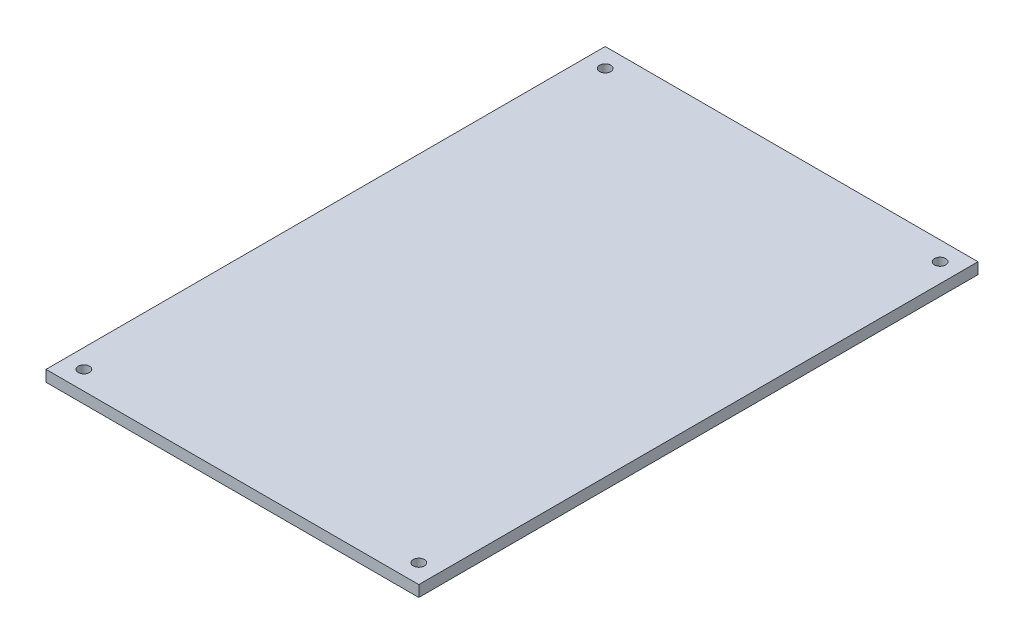
ISO-10303-21;
HEADER;
FILE_DESCRIPTION(('STEP AP214'),'2;1');
FILE_NAME('part.step','',(''),(''),'','','');
FILE_SCHEMA(('AUTOMOTIVE_DESIGN { 1 0 10303 214 1 1 1 1 }'));
ENDSEC;
DATA;
#1=APPLICATION_CONTEXT('core data for automotive mechanical design processes');
#2=APPLICATION_PROTOCOL_DEFINITION('international standard','automotive_design',2000,#1);
#3=PRODUCT_CONTEXT('',#1,'mechanical');
#4=PRODUCT('Part','Part','',(#3));
#5=PRODUCT_RELATED_PRODUCT_CATEGORY('part','',(#4));
#6=PRODUCT_DEFINITION_FORMATION('','',#4);
#7=PRODUCT_DEFINITION_CONTEXT('part definition',#1,'design');
#8=PRODUCT_DEFINITION('design','',#6,#7);
#9=PRODUCT_DEFINITION_SHAPE('','',#8);
#10=(LENGTH_UNIT() NAMED_UNIT(*) SI_UNIT(.MILLI.,.METRE.));
#11=(NAMED_UNIT(*) PLANE_ANGLE_UNIT() SI_UNIT($,.RADIAN.));
#12=(NAMED_UNIT(*) SI_UNIT($,.STERADIAN.) SOLID_ANGLE_UNIT());
#13=UNCERTAINTY_MEASURE_WITH_UNIT(LENGTH_MEASURE(1.E-05),#10,'distance_accuracy_value','');
#14=(GEOMETRIC_REPRESENTATION_CONTEXT(3) GLOBAL_UNCERTAINTY_ASSIGNED_CONTEXT((#13)) GLOBAL_UNIT_ASSIGNED_CONTEXT((#10,
#11,#12)) REPRESENTATION_CONTEXT('',''));
#15=CARTESIAN_POINT('',(0.,0.,0.));
#16=DIRECTION('',(0.,0.,1.));
#17=DIRECTION('',(1.,0.,0.));
#18=AXIS2_PLACEMENT_3D('',#15,#16,#17);
#19=CARTESIAN_POINT('',(49.999999949,3.,74.999999987));
#20=DIRECTION('',(-1.,0.,0.));
#21=DIRECTION('',(0.,0.,1.));
#22=AXIS2_PLACEMENT_3D('',#19,#20,#21);
#23=PLANE('',#22);
#24=DIRECTION('',(0.,0.,-1.));
#25=VECTOR('',#24,1.);
#26=CARTESIAN_POINT('',(49.999999949,0.,74.999999987));
#27=LINE('',#26,#25);
#28=CARTESIAN_POINT('',(49.999999949,0.,74.999999987));
#29=VERTEX_POINT('',#28);
#30=CARTESIAN_POINT('',(49.999999949,0.,-74.999999987));
#31=VERTEX_POINT('',#30);
#32=EDGE_CURVE('E96',#29,#31,#27,.T.);
#33=ORIENTED_EDGE('',*,*,#32,.T.);
#34=DIRECTION('',(0.,-1.,0.));
#35=VECTOR('',#34,1.);
#36=CARTESIAN_POINT('',(49.999999949,3.,-74.999999987));
#37=LINE('',#36,#35);
#38=CARTESIAN_POINT('',(49.999999949,3.,-74.999999987));
#39=VERTEX_POINT('',#38);
#40=EDGE_CURVE('E11',#39,#31,#37,.T.);
#41=ORIENTED_EDGE('',*,*,#40,.F.);
#42=DIRECTION('',(0.,0.,-1.));
#43=VECTOR('',#42,1.);
#44=CARTESIAN_POINT('',(49.999999949,3.,74.999999987));
#45=LINE('',#44,#43);
#46=CARTESIAN_POINT('',(49.999999949,3.,74.999999987));
#47=VERTEX_POINT('',#46);
#48=EDGE_CURVE('E84',#47,#39,#45,.T.);
#49=ORIENTED_EDGE('',*,*,#48,.F.);
#50=DIRECTION('',(0.,-1.,0.));
#51=VECTOR('',#50,1.);
#52=CARTESIAN_POINT('',(49.999999949,3.,74.999999987));
#53=LINE('',#52,#51);
#54=EDGE_CURVE('E92',#47,#29,#53,.T.);
#55=ORIENTED_EDGE('',*,*,#54,.T.);
#56=EDGE_LOOP('',(#33,#41,#49,#55));
#57=FACE_BOUND('',#56,.T.);
#58=ADVANCED_FACE('F33',(#57),#23,.F.);
#59=CARTESIAN_POINT('',(-49.999999949,3.,-74.999999987));
#60=DIRECTION('',(0.,0.,1.));
#61=DIRECTION('',(1.,0.,0.));
#62=AXIS2_PLACEMENT_3D('',#59,#60,#61);
#63=PLANE('',#62);
#64=DIRECTION('',(-1.,0.,0.));
#65=VECTOR('',#64,1.);
#66=CARTESIAN_POINT('',(-49.999999949,0.,-74.999999987));
#67=LINE('',#66,#65);
#68=CARTESIAN_POINT('',(-49.999999949,0.,-74.999999987));
#69=VERTEX_POINT('',#68);
#70=EDGE_CURVE('E88',#31,#69,#67,.T.);
#71=ORIENTED_EDGE('',*,*,#70,.T.);
#72=DIRECTION('',(0.,-1.,0.));
#73=VECTOR('',#72,1.);
#74=CARTESIAN_POINT('',(-49.999999949,3.,-74.999999987));
#75=LINE('',#74,#73);
#76=CARTESIAN_POINT('',(-49.999999949,3.,-74.999999987));
#77=VERTEX_POINT('',#76);
#78=EDGE_CURVE('E41',#77,#69,#75,.T.);
#79=ORIENTED_EDGE('',*,*,#78,.F.);
#80=DIRECTION('',(-1.,0.,0.));
#81=VECTOR('',#80,1.);
#82=CARTESIAN_POINT('',(-49.999999949,3.,-74.999999987));
#83=LINE('',#82,#81);
#84=EDGE_CURVE('E79',#39,#77,#83,.T.);
#85=ORIENTED_EDGE('',*,*,#84,.F.);
#86=ORIENTED_EDGE('',*,*,#40,.T.);
#87=EDGE_LOOP('',(#71,#79,#85,#86));
#88=FACE_BOUND('',#87,.T.);
#89=ADVANCED_FACE('F87',(#88),#63,.F.);
#90=CARTESIAN_POINT('',(-49.999999949,3.,74.999999987));
#91=DIRECTION('',(1.,0.,0.));
#92=DIRECTION('',(0.,0.,-1.));
#93=AXIS2_PLACEMENT_3D('',#90,#91,#92);
#94=PLANE('',#93);
#95=DIRECTION('',(0.,0.,1.));
#96=VECTOR('',#95,1.);
#97=CARTESIAN_POINT('',(-49.999999949,0.,74.999999987));
#98=LINE('',#97,#96);
#99=CARTESIAN_POINT('',(-49.999999949,0.,74.999999987));
#100=VERTEX_POINT('',#99);
#101=EDGE_CURVE('E66',#69,#100,#98,.T.);
#102=ORIENTED_EDGE('',*,*,#101,.T.);
#103=DIRECTION('',(0.,-1.,0.));
#104=VECTOR('',#103,1.);
#105=CARTESIAN_POINT('',(-49.999999949,3.,74.999999987));
#106=LINE('',#105,#104);
#107=CARTESIAN_POINT('',(-49.999999949,3.,74.999999987));
#108=VERTEX_POINT('',#107);
#109=EDGE_CURVE('E89',#108,#100,#106,.T.);
#110=ORIENTED_EDGE('',*,*,#109,.F.);
#111=DIRECTION('',(0.,0.,1.));
#112=VECTOR('',#111,1.);
#113=CARTESIAN_POINT('',(-49.999999949,3.,74.999999987));
#114=LINE('',#113,#112);
#115=EDGE_CURVE('E82',#77,#108,#114,.T.);
#116=ORIENTED_EDGE('',*,*,#115,.F.);
#117=ORIENTED_EDGE('',*,*,#78,.T.);
#118=EDGE_LOOP('',(#102,#110,#116,#117));
#119=FACE_BOUND('',#118,.T.);
#120=ADVANCED_FACE('F90',(#119),#94,.F.);
#121=CARTESIAN_POINT('',(-49.999999949,3.,74.999999987));
#122=DIRECTION('',(0.,0.,-1.));
#123=DIRECTION('',(-1.,0.,0.));
#124=AXIS2_PLACEMENT_3D('',#121,#122,#123);
#125=PLANE('',#124);
#126=DIRECTION('',(1.,0.,0.));
#127=VECTOR('',#126,1.);
#128=CARTESIAN_POINT('',(-49.999999949,0.,74.999999987));
#129=LINE('',#128,#127);
#130=EDGE_CURVE('E72',#100,#29,#129,.T.);
#131=ORIENTED_EDGE('',*,*,#130,.T.);
#132=ORIENTED_EDGE('',*,*,#54,.F.);
#133=DIRECTION('',(1.,0.,0.));
#134=VECTOR('',#133,1.);
#135=CARTESIAN_POINT('',(-49.999999949,3.,74.999999987));
#136=LINE('',#135,#134);
#137=EDGE_CURVE('E49',#108,#47,#136,.T.);
#138=ORIENTED_EDGE('',*,*,#137,.F.);
#139=ORIENTED_EDGE('',*,*,#109,.T.);
#140=EDGE_LOOP('',(#131,#132,#138,#139));
#141=FACE_BOUND('',#140,.T.);
#142=ADVANCED_FACE('F104',(#141),#125,.F.);
#143=CARTESIAN_POINT('',(0.,3.,0.));
#144=DIRECTION('',(0.,-1.,0.));
#145=DIRECTION('',(0.,0.,-1.));
#146=AXIS2_PLACEMENT_3D('',#143,#144,#145);
#147=PLANE('',#146);
#148=CARTESIAN_POINT('',(44.919999949,3.,69.919999987));
#149=DIRECTION('',(0.,1.,0.));
#150=DIRECTION('',(0.,0.,1.));
#151=AXIS2_PLACEMENT_3D('',#148,#149,#150);
#152=CIRCLE('',#151,1.5);
#153=CARTESIAN_POINT('',(44.919999949,3.,71.419999987));
#154=VERTEX_POINT('',#153);
#155=EDGE_CURVE('E128',#154,#154,#152,.T.);
#156=ORIENTED_EDGE('',*,*,#155,.F.);
#157=EDGE_LOOP('',(#156));
#158=FACE_BOUND('',#157,.T.);
#159=CARTESIAN_POINT('',(-44.919999949,3.,69.919999987));
#160=DIRECTION('',(0.,1.,0.));
#161=DIRECTION('',(0.,0.,1.));
#162=AXIS2_PLACEMENT_3D('',#159,#160,#161);
#163=CIRCLE('',#162,1.5);
#164=CARTESIAN_POINT('',(-44.919999949,3.,71.419999987));
#165=VERTEX_POINT('',#164);
#166=EDGE_CURVE('E122',#165,#165,#163,.T.);
#167=ORIENTED_EDGE('',*,*,#166,.F.);
#168=EDGE_LOOP('',(#167));
#169=FACE_BOUND('',#168,.T.);
#170=CARTESIAN_POINT('',(44.919999949,3.,-69.919999987));
#171=DIRECTION('',(0.,1.,0.));
#172=DIRECTION('',(0.,0.,1.));
#173=AXIS2_PLACEMENT_3D('',#170,#171,#172);
#174=CIRCLE('',#173,1.5);
#175=CARTESIAN_POINT('',(44.919999949,3.,-68.419999987));
#176=VERTEX_POINT('',#175);
#177=EDGE_CURVE('E116',#176,#176,#174,.T.);
#178=ORIENTED_EDGE('',*,*,#177,.F.);
#179=EDGE_LOOP('',(#178));
#180=FACE_BOUND('',#179,.T.);
#181=CARTESIAN_POINT('',(-44.919999949,3.,-69.919999987));
#182=DIRECTION('',(0.,1.,0.));
#183=DIRECTION('',(0.,0.,1.));
#184=AXIS2_PLACEMENT_3D('',#181,#182,#183);
#185=CIRCLE('',#184,1.500000048);
#186=CARTESIAN_POINT('',(-44.919999949,3.,-68.419999939));
#187=VERTEX_POINT('',#186);
#188=EDGE_CURVE('E110',#187,#187,#185,.T.);
#189=ORIENTED_EDGE('',*,*,#188,.F.);
#190=EDGE_LOOP('',(#189));
#191=FACE_BOUND('',#190,.T.);
#192=ORIENTED_EDGE('',*,*,#48,.T.);
#193=ORIENTED_EDGE('',*,*,#84,.T.);
#194=ORIENTED_EDGE('',*,*,#115,.T.);
#195=ORIENTED_EDGE('',*,*,#137,.T.);
#196=EDGE_LOOP('',(#192,#193,#194,#195));
#197=FACE_BOUND('',#196,.T.);
#198=ADVANCED_FACE('F80',(#158,#169,#180,#191,#197),#147,.F.);
#199=CARTESIAN_POINT('',(0.,0.,0.));
#200=DIRECTION('',(0.,-1.,0.));
#201=DIRECTION('',(0.,0.,-1.));
#202=AXIS2_PLACEMENT_3D('',#199,#200,#201);
#203=PLANE('',#202);
#204=CARTESIAN_POINT('',(44.919999949,0.,69.919999987));
#205=DIRECTION('',(0.,1.,0.));
#206=DIRECTION('',(0.,0.,1.));
#207=AXIS2_PLACEMENT_3D('',#204,#205,#206);
#208=CIRCLE('',#207,1.5);
#209=CARTESIAN_POINT('',(44.919999949,0.,71.419999987));
#210=VERTEX_POINT('',#209);
#211=EDGE_CURVE('E125',#210,#210,#208,.T.);
#212=ORIENTED_EDGE('',*,*,#211,.T.);
#213=EDGE_LOOP('',(#212));
#214=FACE_BOUND('',#213,.T.);
#215=CARTESIAN_POINT('',(-44.919999949,0.,69.919999987));
#216=DIRECTION('',(0.,1.,0.));
#217=DIRECTION('',(0.,0.,1.));
#218=AXIS2_PLACEMENT_3D('',#215,#216,#217);
#219=CIRCLE('',#218,1.5);
#220=CARTESIAN_POINT('',(-44.919999949,0.,71.419999987));
#221=VERTEX_POINT('',#220);
#222=EDGE_CURVE('E119',#221,#221,#219,.T.);
#223=ORIENTED_EDGE('',*,*,#222,.T.);
#224=EDGE_LOOP('',(#223));
#225=FACE_BOUND('',#224,.T.);
#226=CARTESIAN_POINT('',(44.919999949,0.,-69.919999987));
#227=DIRECTION('',(0.,1.,0.));
#228=DIRECTION('',(0.,0.,1.));
#229=AXIS2_PLACEMENT_3D('',#226,#227,#228);
#230=CIRCLE('',#229,1.5);
#231=CARTESIAN_POINT('',(44.919999949,0.,-68.419999987));
#232=VERTEX_POINT('',#231);
#233=EDGE_CURVE('E113',#232,#232,#230,.T.);
#234=ORIENTED_EDGE('',*,*,#233,.T.);
#235=EDGE_LOOP('',(#234));
#236=FACE_BOUND('',#235,.T.);
#237=CARTESIAN_POINT('',(-44.919999949,0.,-69.919999987));
#238=DIRECTION('',(0.,1.,0.));
#239=DIRECTION('',(0.,0.,1.));
#240=AXIS2_PLACEMENT_3D('',#237,#238,#239);
#241=CIRCLE('',#240,1.500000048);
#242=CARTESIAN_POINT('',(-44.919999949,0.,-68.419999939));
#243=VERTEX_POINT('',#242);
#244=EDGE_CURVE('E99',#243,#243,#241,.T.);
#245=ORIENTED_EDGE('',*,*,#244,.T.);
#246=EDGE_LOOP('',(#245));
#247=FACE_BOUND('',#246,.T.);
#248=ORIENTED_EDGE('',*,*,#32,.F.);
#249=ORIENTED_EDGE('',*,*,#130,.F.);
#250=ORIENTED_EDGE('',*,*,#101,.F.);
#251=ORIENTED_EDGE('',*,*,#70,.F.);
#252=EDGE_LOOP('',(#248,#249,#250,#251));
#253=FACE_BOUND('',#252,.T.);
#254=ADVANCED_FACE('F107',(#214,#225,#236,#247,#253),#203,.T.);
#255=CARTESIAN_POINT('',(-44.919999949,0.,-69.919999987));
#256=DIRECTION('',(0.,1.,0.));
#257=DIRECTION('',(0.,0.,1.));
#258=AXIS2_PLACEMENT_3D('',#255,#256,#257);
#259=CYLINDRICAL_SURFACE('',#258,1.500000048);
#260=ORIENTED_EDGE('',*,*,#244,.F.);
#261=EDGE_LOOP('',(#260));
#262=FACE_BOUND('',#261,.T.);
#263=ORIENTED_EDGE('',*,*,#188,.T.);
#264=EDGE_LOOP('',(#263));
#265=FACE_BOUND('',#264,.T.);
#266=ADVANCED_FACE('F152',(#262,#265),#259,.F.);
#267=CARTESIAN_POINT('',(44.919999949,0.,-69.919999987));
#268=DIRECTION('',(0.,1.,0.));
#269=DIRECTION('',(0.,0.,1.));
#270=AXIS2_PLACEMENT_3D('',#267,#268,#269);
#271=CYLINDRICAL_SURFACE('',#270,1.5);
#272=ORIENTED_EDGE('',*,*,#233,.F.);
#273=EDGE_LOOP('',(#272));
#274=FACE_BOUND('',#273,.T.);
#275=ORIENTED_EDGE('',*,*,#177,.T.);
#276=EDGE_LOOP('',(#275));
#277=FACE_BOUND('',#276,.T.);
#278=ADVANCED_FACE('F154',(#274,#277),#271,.F.);
#279=CARTESIAN_POINT('',(-44.919999949,0.,69.919999987));
#280=DIRECTION('',(0.,1.,0.));
#281=DIRECTION('',(0.,0.,1.));
#282=AXIS2_PLACEMENT_3D('',#279,#280,#281);
#283=CYLINDRICAL_SURFACE('',#282,1.5);
#284=ORIENTED_EDGE('',*,*,#222,.F.);
#285=EDGE_LOOP('',(#284));
#286=FACE_BOUND('',#285,.T.);
#287=ORIENTED_EDGE('',*,*,#166,.T.);
#288=EDGE_LOOP('',(#287));
#289=FACE_BOUND('',#288,.T.);
#290=ADVANCED_FACE('F139',(#286,#289),#283,.F.);
#291=CARTESIAN_POINT('',(44.919999949,0.,69.919999987));
#292=DIRECTION('',(0.,1.,0.));
#293=DIRECTION('',(0.,0.,1.));
#294=AXIS2_PLACEMENT_3D('',#291,#292,#293);
#295=CYLINDRICAL_SURFACE('',#294,1.5);
#296=ORIENTED_EDGE('',*,*,#211,.F.);
#297=EDGE_LOOP('',(#296));
#298=FACE_BOUND('',#297,.T.);
#299=ORIENTED_EDGE('',*,*,#155,.T.);
#300=EDGE_LOOP('',(#299));
#301=FACE_BOUND('',#300,.T.);
#302=ADVANCED_FACE('F136',(#298,#301),#295,.F.);
#303=CLOSED_SHELL('',(#58,#89,#120,#142,#198,#254,#266,#278,#290,#302));
#304=MANIFOLD_SOLID_BREP('B2',#303);
#305=ADVANCED_BREP_SHAPE_REPRESENTATION('',(#18,#304),#14);
#306=SHAPE_DEFINITION_REPRESENTATION(#9,#305);
ENDSEC;
END-ISO-10303-21;
